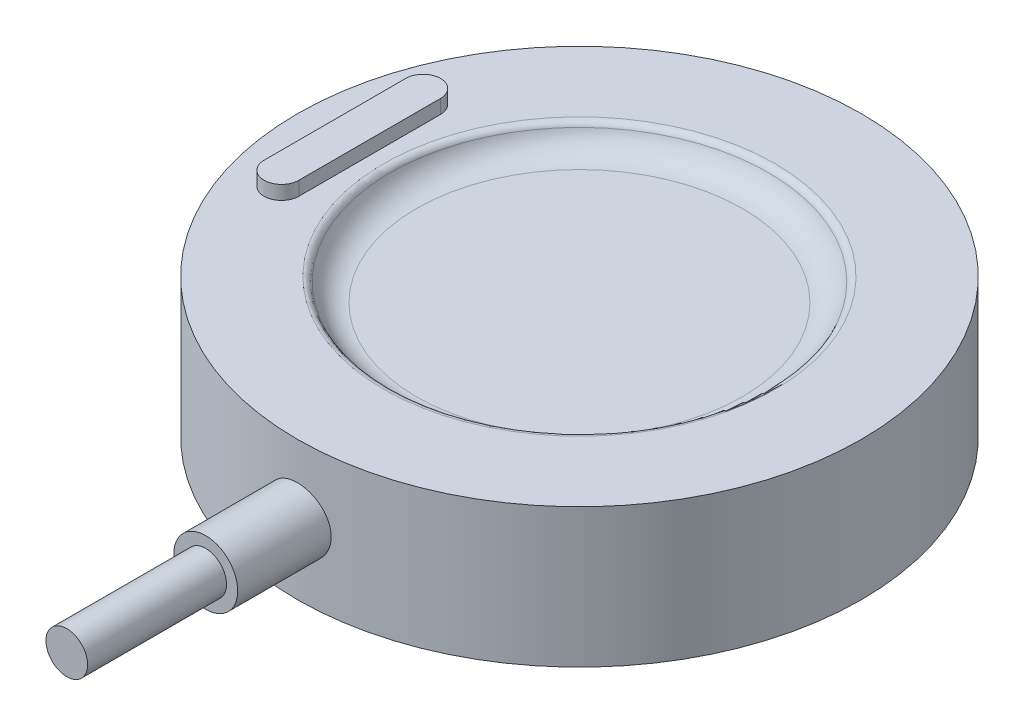
ISO-10303-21;
HEADER;
FILE_DESCRIPTION(('STEP AP214'),'2;1');
FILE_NAME('part.step','',(''),(''),'','','');
FILE_SCHEMA(('AUTOMOTIVE_DESIGN { 1 0 10303 214 1 1 1 1 }'));
ENDSEC;
DATA;
#1=APPLICATION_CONTEXT('core data for automotive mechanical design processes');
#2=APPLICATION_PROTOCOL_DEFINITION('international standard','automotive_design',2000,#1);
#3=PRODUCT_CONTEXT('',#1,'mechanical');
#4=PRODUCT('Part','Part','',(#3));
#5=PRODUCT_RELATED_PRODUCT_CATEGORY('part','',(#4));
#6=PRODUCT_DEFINITION_FORMATION('','',#4);
#7=PRODUCT_DEFINITION_CONTEXT('part definition',#1,'design');
#8=PRODUCT_DEFINITION('design','',#6,#7);
#9=PRODUCT_DEFINITION_SHAPE('','',#8);
#10=(LENGTH_UNIT() NAMED_UNIT(*) SI_UNIT(.MILLI.,.METRE.));
#11=(NAMED_UNIT(*) PLANE_ANGLE_UNIT() SI_UNIT($,.RADIAN.));
#12=(NAMED_UNIT(*) SI_UNIT($,.STERADIAN.) SOLID_ANGLE_UNIT());
#13=UNCERTAINTY_MEASURE_WITH_UNIT(LENGTH_MEASURE(1.E-05),#10,'distance_accuracy_value','');
#14=(GEOMETRIC_REPRESENTATION_CONTEXT(3) GLOBAL_UNCERTAINTY_ASSIGNED_CONTEXT((#13)) GLOBAL_UNIT_ASSIGNED_CONTEXT((#10,
#11,#12)) REPRESENTATION_CONTEXT('',''));
#15=CARTESIAN_POINT('',(0.,0.,0.));
#16=DIRECTION('',(0.,0.,1.));
#17=DIRECTION('',(1.,0.,0.));
#18=AXIS2_PLACEMENT_3D('',#15,#16,#17);
#19=CARTESIAN_POINT('',(0.,10.,0.));
#20=DIRECTION('',(0.,1.,0.));
#21=DIRECTION('',(0.,0.,1.));
#22=AXIS2_PLACEMENT_3D('',#19,#20,#21);
#23=PLANE('',#22);
#24=CARTESIAN_POINT('',(0.,10.,0.));
#25=DIRECTION('',(0.,1.,0.));
#26=DIRECTION('',(0.,0.,1.));
#27=AXIS2_PLACEMENT_3D('',#24,#25,#26);
#28=CIRCLE('',#27,14.0782592919623);
#29=CARTESIAN_POINT('',(0.,10.,14.0782592919623));
#30=VERTEX_POINT('',#29);
#31=EDGE_CURVE('E11',#30,#30,#28,.F.);
#32=ORIENTED_EDGE('',*,*,#31,.T.);
#33=EDGE_LOOP('',(#32));
#34=FACE_BOUND('',#33,.T.);
#35=CARTESIAN_POINT('',(0.,10.,0.));
#36=DIRECTION('',(0.,1.,0.));
#37=DIRECTION('',(0.,0.,1.));
#38=AXIS2_PLACEMENT_3D('',#35,#36,#37);
#39=CIRCLE('',#38,20.3);
#40=CARTESIAN_POINT('',(0.,10.,20.3));
#41=VERTEX_POINT('',#40);
#42=EDGE_CURVE('E128',#41,#41,#39,.T.);
#43=ORIENTED_EDGE('',*,*,#42,.T.);
#44=EDGE_LOOP('',(#43));
#45=FACE_BOUND('',#44,.T.);
#46=DIRECTION('',(0.,0.,1.));
#47=VECTOR('',#46,1.);
#48=CARTESIAN_POINT('',(-17.6,10.,-5.1));
#49=LINE('',#48,#47);
#50=CARTESIAN_POINT('',(-17.6,10.,-5.1));
#51=VERTEX_POINT('',#50);
#52=CARTESIAN_POINT('',(-17.6,10.,5.1));
#53=VERTEX_POINT('',#52);
#54=EDGE_CURVE('E95',#51,#53,#49,.T.);
#55=ORIENTED_EDGE('',*,*,#54,.F.);
#56=CARTESIAN_POINT('',(-16.35,10.,-5.1));
#57=DIRECTION('',(0.,1.,0.));
#58=DIRECTION('',(0.,0.,1.));
#59=AXIS2_PLACEMENT_3D('',#56,#57,#58);
#60=CIRCLE('',#59,1.25);
#61=CARTESIAN_POINT('',(-15.1,10.,-5.1));
#62=VERTEX_POINT('',#61);
#63=EDGE_CURVE('E106',#62,#51,#60,.T.);
#64=ORIENTED_EDGE('',*,*,#63,.F.);
#65=DIRECTION('',(0.,0.,-1.));
#66=VECTOR('',#65,1.);
#67=CARTESIAN_POINT('',(-15.1,10.,-5.1));
#68=LINE('',#67,#66);
#69=CARTESIAN_POINT('',(-15.1,10.,5.1));
#70=VERTEX_POINT('',#69);
#71=EDGE_CURVE('E76',#70,#62,#68,.T.);
#72=ORIENTED_EDGE('',*,*,#71,.F.);
#73=CARTESIAN_POINT('',(-16.35,10.,5.1));
#74=DIRECTION('',(0.,1.,0.));
#75=DIRECTION('',(0.,0.,1.));
#76=AXIS2_PLACEMENT_3D('',#73,#74,#75);
#77=CIRCLE('',#76,1.25);
#78=EDGE_CURVE('E110',#53,#70,#77,.T.);
#79=ORIENTED_EDGE('',*,*,#78,.F.);
#80=EDGE_LOOP('',(#55,#64,#72,#79));
#81=FACE_BOUND('',#80,.T.);
#82=ADVANCED_FACE('F39',(#34,#45,#81),#23,.T.);
#83=CARTESIAN_POINT('',(0.,10.,0.));
#84=DIRECTION('',(0.,-1.,0.));
#85=DIRECTION('',(0.,0.,-1.));
#86=AXIS2_PLACEMENT_3D('',#83,#84,#85);
#87=CYLINDRICAL_SURFACE('',#86,20.3);
#88=ORIENTED_EDGE('',*,*,#42,.F.);
#89=EDGE_LOOP('',(#88));
#90=FACE_BOUND('',#89,.T.);
#91=CARTESIAN_POINT('',(0.,0.,0.));
#92=DIRECTION('',(0.,1.,0.));
#93=DIRECTION('',(0.,0.,1.));
#94=AXIS2_PLACEMENT_3D('',#91,#92,#93);
#95=CIRCLE('',#94,20.3);
#96=CARTESIAN_POINT('',(0.,0.,20.3));
#97=VERTEX_POINT('',#96);
#98=EDGE_CURVE('E127',#97,#97,#95,.T.);
#99=ORIENTED_EDGE('',*,*,#98,.T.);
#100=EDGE_LOOP('',(#99));
#101=FACE_BOUND('',#100,.T.);
#102=CARTESIAN_POINT('',(-2.3,5.,20.1692835767659));
#103=CARTESIAN_POINT('',(-2.29999447246632,4.8712536242912,20.1692852706117));
#104=CARTESIAN_POINT('',(-2.28915336377166,4.74242446915981,20.170529612203));
#105=CARTESIAN_POINT('',(-2.24607365742749,4.48834479705072,20.1753712431094));
#106=CARTESIAN_POINT('',(-2.21381209512011,4.36309827145709,20.1789710576439));
#107=CARTESIAN_POINT('',(-2.12884893891182,4.11989969883184,20.1881107684846));
#108=CARTESIAN_POINT('',(-2.07616048343137,4.00194301945346,20.1936494175256));
#109=CARTESIAN_POINT('',(-1.95186593036909,3.77657026912771,20.2060412151851));
#110=CARTESIAN_POINT('',(-1.88026332527742,3.66915225723625,20.2128941210627));
#111=CARTESIAN_POINT('',(-1.71981787150712,3.46738556399077,20.2271777795977));
#112=CARTESIAN_POINT('',(-1.63090515660017,3.37309259507989,20.234610798283));
#113=CARTESIAN_POINT('',(-1.43851335828938,3.20073315650021,20.2491967053591));
#114=CARTESIAN_POINT('',(-1.33503357990873,3.12266746145515,20.2563495803637));
#115=CARTESIAN_POINT('',(-1.11609874457757,2.98478190378643,20.2695921152412));
#116=CARTESIAN_POINT('',(-1.00061204693668,2.92501197507673,20.2756788463232));
#117=CARTESIAN_POINT('',(-0.761160397353399,2.82573422518143,20.2860784856631));
#118=CARTESIAN_POINT('',(-0.637195706558893,2.78622578019904,20.2903914485297));
#119=CARTESIAN_POINT('',(-0.384873951221556,2.72875761699013,20.2967416601373));
#120=CARTESIAN_POINT('',(-0.256538126693559,2.71070573396125,20.29878863959));
#121=CARTESIAN_POINT('',(0.00135671858746649,2.69637771454084,20.3004094122102));
#122=CARTESIAN_POINT('',(0.130915699196795,2.70010086596105,20.2999832862646));
#123=CARTESIAN_POINT('',(0.38695278936002,2.72914289795977,20.2967137778463));
#124=CARTESIAN_POINT('',(0.513442302576644,2.75436266685797,20.2938814893549));
#125=CARTESIAN_POINT('',(0.760381816029197,2.8255273667628,20.2861304884299));
#126=CARTESIAN_POINT('',(0.880831719076606,2.87147263116221,20.2812117424333));
#127=CARTESIAN_POINT('',(1.11258248181574,2.98289111994473,20.2698215361263));
#128=CARTESIAN_POINT('',(1.22386231482537,3.0484077137263,20.2633466337205));
#129=CARTESIAN_POINT('',(1.43388470809187,3.19707756899337,20.2495695877795));
#130=CARTESIAN_POINT('',(1.53262679562162,3.28023149516695,20.2422674130722));
#131=CARTESIAN_POINT('',(1.71535218698093,3.46237183846585,20.2276057397474));
#132=CARTESIAN_POINT('',(1.79924948294547,3.5614445559899,20.2202461495183));
#133=CARTESIAN_POINT('',(1.94923658345396,3.77231235494073,20.2063398085459));
#134=CARTESIAN_POINT('',(2.01532634859414,3.88410746451832,20.1997930596013));
#135=CARTESIAN_POINT('',(2.12782460671585,4.11731800282686,20.1882534414606));
#136=CARTESIAN_POINT('',(2.17422699251094,4.23873640293931,20.1832610545679));
#137=CARTESIAN_POINT('',(2.24596110920425,4.48771063562767,20.175405142089));
#138=CARTESIAN_POINT('',(2.27129366924051,4.61526622648436,20.1725415327318));
#139=CARTESIAN_POINT('',(2.30005675522029,4.87213665250542,20.1692823633291));
#140=CARTESIAN_POINT('',(2.30360796607372,5.00143780820493,20.1688732040786));
#141=CARTESIAN_POINT('',(2.28902524291448,5.25879325780216,20.1705333389106));
#142=CARTESIAN_POINT('',(2.27089168689779,5.38684757339483,20.1726025897911));
#143=CARTESIAN_POINT('',(2.21355547358094,5.63771759445219,20.1789740055028));
#144=CARTESIAN_POINT('',(2.17441057317288,5.76054666905243,20.1832700481267));
#145=CARTESIAN_POINT('',(2.07622206024786,5.99789645364751,20.1936060350472));
#146=CARTESIAN_POINT('',(2.01717786791588,6.1124169214324,20.1996460301573));
#147=CARTESIAN_POINT('',(1.88056732265308,6.3304467142302,20.2128221246577));
#148=CARTESIAN_POINT('',(1.80292141553732,6.43390590704359,20.2199628836074));
#149=CARTESIAN_POINT('',(1.63142475434021,6.6263663660574,20.2345210013135));
#150=CARTESIAN_POINT('',(1.53757348406934,6.71536717153939,20.2419383688749));
#151=CARTESIAN_POINT('',(1.33580478184039,6.87680455200966,20.2562553856401));
#152=CARTESIAN_POINT('',(1.22782391692881,6.94916210692591,20.2631524646433));
#153=CARTESIAN_POINT('',(1.0011720652608,7.07471374993312,20.2756138821204));
#154=CARTESIAN_POINT('',(0.882501260481591,7.12790816416546,20.2811782432755));
#155=CARTESIAN_POINT('',(0.638107281111662,7.21349135109515,20.2903357757522));
#156=CARTESIAN_POINT('',(0.512400627039231,7.24592680791103,20.2939333673975));
#157=CARTESIAN_POINT('',(0.257282333907098,7.28922348063828,20.2987702644268));
#158=CARTESIAN_POINT('',(0.12787083083715,7.30008548739485,20.3000096562581));
#159=CARTESIAN_POINT('',(-0.130209838237317,7.29991397397099,20.2999902825492));
#160=CARTESIAN_POINT('',(-0.258879103828066,7.28900270213114,20.2987454648589));
#161=CARTESIAN_POINT('',(-0.512543450415826,7.245852008089,20.2939251450371));
#162=CARTESIAN_POINT('',(-0.637538531026222,7.21361258364247,20.2903496426602));
#163=CARTESIAN_POINT('',(-0.880297695804303,7.12875695256549,20.2812681853638));
#164=CARTESIAN_POINT('',(-0.998063457794914,7.07614549486888,20.2757626803762));
#165=CARTESIAN_POINT('',(-1.22311306625227,6.95205197410282,20.2634328574793));
#166=CARTESIAN_POINT('',(-1.33039687922915,6.88056985074422,20.2566085353566));
#167=CARTESIAN_POINT('',(-1.53206299331337,6.72030837010864,20.2423584140276));
#168=CARTESIAN_POINT('',(-1.62637269887799,6.63143792848763,20.23492957339));
#169=CARTESIAN_POINT('',(-1.79879086595814,6.43910836721134,20.2203328106986));
#170=CARTESIAN_POINT('',(-1.87689546196572,6.33564577666163,20.2131649512338));
#171=CARTESIAN_POINT('',(-2.01489287793036,6.11669672094436,20.1998772958777));
#172=CARTESIAN_POINT('',(-2.07472672315997,6.00117290122749,20.1937609211819));
#173=CARTESIAN_POINT('',(-2.17406349266092,5.76171727181989,20.1833090788548));
#174=CARTESIAN_POINT('',(-2.21358893639794,5.63779494843044,20.1789716396895));
#175=CARTESIAN_POINT('',(-2.26152811662105,5.42766704669919,20.1736422020554));
#176=CARTESIAN_POINT('',(-2.27593484213664,5.34279627027259,20.1720156523556));
#177=CARTESIAN_POINT('',(-2.2951726021772,5.17196263692571,20.1698357770988));
#178=CARTESIAN_POINT('',(-2.3000036922726,5.08599978634597,20.1692824453137));
#179=CARTESIAN_POINT('',(-2.3,5.,20.1692835767659));
#180=B_SPLINE_CURVE_WITH_KNOTS('',3,(#102,#103,#104,#105,#106,#107,#108,#109,#110,#111,#112,
#113,#114,#115,#116,#117,#118,#119,#120,#121,#122,#123,#124,#125,#126,#127,#128,#129,#130,#131,
#132,#133,#134,#135,#136,#137,#138,#139,#140,#141,#142,#143,#144,#145,#146,#147,#148,#149,#150,
#151,#152,#153,#154,#155,#156,#157,#158,#159,#160,#161,#162,#163,#164,#165,#166,#167,#168,#169,
#170,#171,#172,#173,#174,#175,#176,#177,#178,#179),.UNSPECIFIED.,.T.,.F.,(4,2,2,2,2,2,2,2,2,2,2,
2,2,2,2,2,2,2,2,2,2,2,2,2,2,2,2,2,2,2,2,2,2,2,2,2,2,2,4),(0.,0.38592501471668,0.772264445365764,
1.15835579662077,1.54437590603613,1.93198762008714,2.31961783289079,2.70829674589852,
3.09696369180547,3.4839550487891,3.8709337486557,4.25613784715958,4.64134814232317,
5.02741846375862,5.41350333739163,5.80175666474855,6.19001085120938,6.57838538939748,
6.96674464357967,7.35295013977272,7.73914890395917,8.1242914645693,8.50944524822956,
8.89627659069495,9.28312025717542,9.67176434770769,10.0604018235151,10.4481622057578,
10.8359083731163,11.2214836245456,11.6070589165467,11.9925443809755,12.3780310769917,
12.7655938892889,13.1532490433938,13.5421425653009,13.9306039173985,14.1883949522072,
14.4461844909688),.UNSPECIFIED.);
#181=CARTESIAN_POINT('',(-2.3,5.,20.1692835767659));
#182=VERTEX_POINT('',#181);
#183=EDGE_CURVE('E124',#182,#182,#180,.T.);
#184=ORIENTED_EDGE('',*,*,#183,.F.);
#185=EDGE_LOOP('',(#184));
#186=FACE_BOUND('',#185,.T.);
#187=ADVANCED_FACE('F140',(#90,#101,#186),#87,.T.);
#188=CARTESIAN_POINT('',(0.,0.,0.));
#189=DIRECTION('',(0.,1.,0.));
#190=DIRECTION('',(0.,0.,1.));
#191=AXIS2_PLACEMENT_3D('',#188,#189,#190);
#192=PLANE('',#191);
#193=ORIENTED_EDGE('',*,*,#98,.F.);
#194=EDGE_LOOP('',(#193));
#195=FACE_BOUND('',#194,.T.);
#196=ADVANCED_FACE('F149',(#195),#192,.F.);
#197=CARTESIAN_POINT('',(0.,5.,26.9));
#198=DIRECTION('',(0.,0.,-1.));
#199=DIRECTION('',(-1.,0.,0.));
#200=AXIS2_PLACEMENT_3D('',#197,#198,#199);
#201=CYLINDRICAL_SURFACE('',#200,2.3);
#202=CARTESIAN_POINT('',(0.,5.,26.9));
#203=DIRECTION('',(0.,0.,1.));
#204=DIRECTION('',(1.,0.,0.));
#205=AXIS2_PLACEMENT_3D('',#202,#203,#204);
#206=CIRCLE('',#205,2.3);
#207=CARTESIAN_POINT('',(2.3,5.,26.9));
#208=VERTEX_POINT('',#207);
#209=EDGE_CURVE('E119',#208,#208,#206,.T.);
#210=ORIENTED_EDGE('',*,*,#209,.F.);
#211=EDGE_LOOP('',(#210));
#212=FACE_BOUND('',#211,.T.);
#213=ORIENTED_EDGE('',*,*,#183,.T.);
#214=EDGE_LOOP('',(#213));
#215=FACE_BOUND('',#214,.T.);
#216=ADVANCED_FACE('F143',(#212,#215),#201,.T.);
#217=CARTESIAN_POINT('',(0.,5.,26.9));
#218=DIRECTION('',(0.,0.,1.));
#219=DIRECTION('',(1.,0.,0.));
#220=AXIS2_PLACEMENT_3D('',#217,#218,#219);
#221=PLANE('',#220);
#222=CARTESIAN_POINT('',(0.,5.,26.9));
#223=DIRECTION('',(0.,0.,1.));
#224=DIRECTION('',(1.,0.,0.));
#225=AXIS2_PLACEMENT_3D('',#222,#223,#224);
#226=CIRCLE('',#225,1.5);
#227=CARTESIAN_POINT('',(1.5,5.,26.9));
#228=VERTEX_POINT('',#227);
#229=EDGE_CURVE('E120',#228,#228,#226,.T.);
#230=ORIENTED_EDGE('',*,*,#229,.F.);
#231=EDGE_LOOP('',(#230));
#232=FACE_BOUND('',#231,.T.);
#233=ORIENTED_EDGE('',*,*,#209,.T.);
#234=EDGE_LOOP('',(#233));
#235=FACE_BOUND('',#234,.T.);
#236=ADVANCED_FACE('F148',(#232,#235),#221,.T.);
#237=CARTESIAN_POINT('',(0.,5.,36.9));
#238=DIRECTION('',(0.,0.,-1.));
#239=DIRECTION('',(-1.,0.,0.));
#240=AXIS2_PLACEMENT_3D('',#237,#238,#239);
#241=CYLINDRICAL_SURFACE('',#240,1.5);
#242=CARTESIAN_POINT('',(0.,5.,36.9));
#243=DIRECTION('',(0.,0.,1.));
#244=DIRECTION('',(1.,0.,0.));
#245=AXIS2_PLACEMENT_3D('',#242,#243,#244);
#246=CIRCLE('',#245,1.5);
#247=CARTESIAN_POINT('',(1.5,5.,36.9));
#248=VERTEX_POINT('',#247);
#249=EDGE_CURVE('E116',#248,#248,#246,.T.);
#250=ORIENTED_EDGE('',*,*,#249,.F.);
#251=EDGE_LOOP('',(#250));
#252=FACE_BOUND('',#251,.T.);
#253=ORIENTED_EDGE('',*,*,#229,.T.);
#254=EDGE_LOOP('',(#253));
#255=FACE_BOUND('',#254,.T.);
#256=ADVANCED_FACE('F191',(#252,#255),#241,.T.);
#257=CARTESIAN_POINT('',(0.,5.,36.9));
#258=DIRECTION('',(0.,0.,1.));
#259=DIRECTION('',(1.,0.,0.));
#260=AXIS2_PLACEMENT_3D('',#257,#258,#259);
#261=PLANE('',#260);
#262=ORIENTED_EDGE('',*,*,#249,.T.);
#263=EDGE_LOOP('',(#262));
#264=FACE_BOUND('',#263,.T.);
#265=ADVANCED_FACE('F189',(#264),#261,.T.);
#266=CARTESIAN_POINT('',(-16.35,11.,-5.1));
#267=DIRECTION('',(0.,-1.,0.));
#268=DIRECTION('',(0.,0.,-1.));
#269=AXIS2_PLACEMENT_3D('',#266,#267,#268);
#270=CYLINDRICAL_SURFACE('',#269,1.25);
#271=ORIENTED_EDGE('',*,*,#63,.T.);
#272=DIRECTION('',(0.,-1.,0.));
#273=VECTOR('',#272,1.);
#274=CARTESIAN_POINT('',(-17.6,11.,-5.1));
#275=LINE('',#274,#273);
#276=CARTESIAN_POINT('',(-17.6,11.,-5.1));
#277=VERTEX_POINT('',#276);
#278=EDGE_CURVE('E98',#277,#51,#275,.T.);
#279=ORIENTED_EDGE('',*,*,#278,.F.);
#280=CARTESIAN_POINT('',(-16.35,11.,-5.1));
#281=DIRECTION('',(0.,1.,0.));
#282=DIRECTION('',(0.,0.,1.));
#283=AXIS2_PLACEMENT_3D('',#280,#281,#282);
#284=CIRCLE('',#283,1.25);
#285=CARTESIAN_POINT('',(-15.1,11.,-5.1));
#286=VERTEX_POINT('',#285);
#287=EDGE_CURVE('E88',#286,#277,#284,.T.);
#288=ORIENTED_EDGE('',*,*,#287,.F.);
#289=DIRECTION('',(0.,-1.,0.));
#290=VECTOR('',#289,1.);
#291=CARTESIAN_POINT('',(-15.1,11.,-5.1));
#292=LINE('',#291,#290);
#293=EDGE_CURVE('E102',#286,#62,#292,.T.);
#294=ORIENTED_EDGE('',*,*,#293,.T.);
#295=EDGE_LOOP('',(#271,#279,#288,#294));
#296=FACE_BOUND('',#295,.T.);
#297=ADVANCED_FACE('F172',(#296),#270,.T.);
#298=CARTESIAN_POINT('',(-17.6,11.,-5.1));
#299=DIRECTION('',(1.,0.,0.));
#300=DIRECTION('',(0.,0.,-1.));
#301=AXIS2_PLACEMENT_3D('',#298,#299,#300);
#302=PLANE('',#301);
#303=ORIENTED_EDGE('',*,*,#54,.T.);
#304=DIRECTION('',(0.,-1.,0.));
#305=VECTOR('',#304,1.);
#306=CARTESIAN_POINT('',(-17.6,11.,5.1));
#307=LINE('',#306,#305);
#308=CARTESIAN_POINT('',(-17.6,11.,5.1));
#309=VERTEX_POINT('',#308);
#310=EDGE_CURVE('E92',#309,#53,#307,.T.);
#311=ORIENTED_EDGE('',*,*,#310,.F.);
#312=DIRECTION('',(0.,0.,1.));
#313=VECTOR('',#312,1.);
#314=CARTESIAN_POINT('',(-17.6,11.,-5.1));
#315=LINE('',#314,#313);
#316=EDGE_CURVE('E83',#277,#309,#315,.T.);
#317=ORIENTED_EDGE('',*,*,#316,.F.);
#318=ORIENTED_EDGE('',*,*,#278,.T.);
#319=EDGE_LOOP('',(#303,#311,#317,#318));
#320=FACE_BOUND('',#319,.T.);
#321=ADVANCED_FACE('F93',(#320),#302,.F.);
#322=CARTESIAN_POINT('',(-16.35,11.,5.1));
#323=DIRECTION('',(0.,-1.,0.));
#324=DIRECTION('',(0.,0.,-1.));
#325=AXIS2_PLACEMENT_3D('',#322,#323,#324);
#326=CYLINDRICAL_SURFACE('',#325,1.25);
#327=ORIENTED_EDGE('',*,*,#78,.T.);
#328=DIRECTION('',(0.,-1.,0.));
#329=VECTOR('',#328,1.);
#330=CARTESIAN_POINT('',(-15.1,11.,5.1));
#331=LINE('',#330,#329);
#332=CARTESIAN_POINT('',(-15.1,11.,5.1));
#333=VERTEX_POINT('',#332);
#334=EDGE_CURVE('E54',#333,#70,#331,.T.);
#335=ORIENTED_EDGE('',*,*,#334,.F.);
#336=CARTESIAN_POINT('',(-16.35,11.,5.1));
#337=DIRECTION('',(0.,1.,0.));
#338=DIRECTION('',(0.,0.,1.));
#339=AXIS2_PLACEMENT_3D('',#336,#337,#338);
#340=CIRCLE('',#339,1.25);
#341=EDGE_CURVE('E86',#309,#333,#340,.T.);
#342=ORIENTED_EDGE('',*,*,#341,.F.);
#343=ORIENTED_EDGE('',*,*,#310,.T.);
#344=EDGE_LOOP('',(#327,#335,#342,#343));
#345=FACE_BOUND('',#344,.T.);
#346=ADVANCED_FACE('F100',(#345),#326,.T.);
#347=CARTESIAN_POINT('',(-15.1,11.,-5.1));
#348=DIRECTION('',(-1.,0.,0.));
#349=DIRECTION('',(0.,0.,1.));
#350=AXIS2_PLACEMENT_3D('',#347,#348,#349);
#351=PLANE('',#350);
#352=ORIENTED_EDGE('',*,*,#71,.T.);
#353=ORIENTED_EDGE('',*,*,#293,.F.);
#354=DIRECTION('',(0.,0.,-1.));
#355=VECTOR('',#354,1.);
#356=CARTESIAN_POINT('',(-15.1,11.,-5.1));
#357=LINE('',#356,#355);
#358=EDGE_CURVE('E62',#333,#286,#357,.T.);
#359=ORIENTED_EDGE('',*,*,#358,.F.);
#360=ORIENTED_EDGE('',*,*,#334,.T.);
#361=EDGE_LOOP('',(#352,#353,#359,#360));
#362=FACE_BOUND('',#361,.T.);
#363=ADVANCED_FACE('F173',(#362),#351,.F.);
#364=CARTESIAN_POINT('',(-16.35,11.,-5.1));
#365=DIRECTION('',(0.,1.,0.));
#366=DIRECTION('',(0.,0.,1.));
#367=AXIS2_PLACEMENT_3D('',#364,#365,#366);
#368=PLANE('',#367);
#369=ORIENTED_EDGE('',*,*,#287,.T.);
#370=ORIENTED_EDGE('',*,*,#316,.T.);
#371=ORIENTED_EDGE('',*,*,#341,.T.);
#372=ORIENTED_EDGE('',*,*,#358,.T.);
#373=EDGE_LOOP('',(#369,#370,#371,#372));
#374=FACE_BOUND('',#373,.T.);
#375=ADVANCED_FACE('F84',(#374),#368,.T.);
#376=CARTESIAN_POINT('',(0.,8.37,0.));
#377=DIRECTION('',(0.,1.,0.));
#378=DIRECTION('',(0.,0.,1.));
#379=AXIS2_PLACEMENT_3D('',#376,#377,#378);
#380=PLANE('',#379);
#381=CARTESIAN_POINT('',(0.,8.37,0.));
#382=DIRECTION('',(0.,1.,0.));
#383=DIRECTION('',(0.,0.,1.));
#384=AXIS2_PLACEMENT_3D('',#381,#382,#383);
#385=CIRCLE('',#384,11.7345229586688);
#386=CARTESIAN_POINT('',(0.,8.37,11.7345229586688));
#387=VERTEX_POINT('',#386);
#388=EDGE_CURVE('E123',#387,#387,#385,.T.);
#389=ORIENTED_EDGE('',*,*,#388,.T.);
#390=EDGE_LOOP('',(#389));
#391=FACE_BOUND('',#390,.T.);
#392=ADVANCED_FACE('F180',(#391),#380,.T.);
#393=CARTESIAN_POINT('',(0.,10.37,0.));
#394=DIRECTION('',(0.,-1.,0.));
#395=DIRECTION('',(0.,0.,-1.));
#396=AXIS2_PLACEMENT_3D('',#393,#394,#395);
#397=TOROIDAL_SURFACE('',#396,11.7345229586688,2.);
#398=CARTESIAN_POINT('',(0.,9.67399999999999,0.));
#399=DIRECTION('',(0.,1.,0.));
#400=DIRECTION('',(0.,0.,1.));
#401=AXIS2_PLACEMENT_3D('',#398,#399,#400);
#402=CIRCLE('',#401,13.6095120253036);
#403=CARTESIAN_POINT('',(0.,9.67399999999999,13.6095120253036));
#404=VERTEX_POINT('',#403);
#405=EDGE_CURVE('E47',#404,#404,#402,.T.);
#406=ORIENTED_EDGE('',*,*,#405,.T.);
#407=EDGE_LOOP('',(#406));
#408=FACE_BOUND('',#407,.T.);
#409=ORIENTED_EDGE('',*,*,#388,.F.);
#410=EDGE_LOOP('',(#409));
#411=FACE_BOUND('',#410,.T.);
#412=ADVANCED_FACE('F286',(#408,#411),#397,.F.);
#413=CARTESIAN_POINT('',(0.,9.5,0.));
#414=DIRECTION('',(0.,1.,0.));
#415=DIRECTION('',(0.,0.,1.));
#416=AXIS2_PLACEMENT_3D('',#413,#414,#415);
#417=TOROIDAL_SURFACE('',#416,14.0782592919623,0.5);
#418=ORIENTED_EDGE('',*,*,#31,.F.);
#419=EDGE_LOOP('',(#418));
#420=FACE_BOUND('',#419,.T.);
#421=ORIENTED_EDGE('',*,*,#405,.F.);
#422=EDGE_LOOP('',(#421));
#423=FACE_BOUND('',#422,.T.);
#424=ADVANCED_FACE('F41',(#420,#423),#417,.T.);
#425=CLOSED_SHELL('',(#82,#187,#196,#216,#236,#256,#265,#297,#321,#346,#363,#375,#392,#412,#424));
#426=MANIFOLD_SOLID_BREP('B2',#425);
#427=ADVANCED_BREP_SHAPE_REPRESENTATION('',(#18,#426),#14);
#428=SHAPE_DEFINITION_REPRESENTATION(#9,#427);
ENDSEC;
END-ISO-10303-21;
